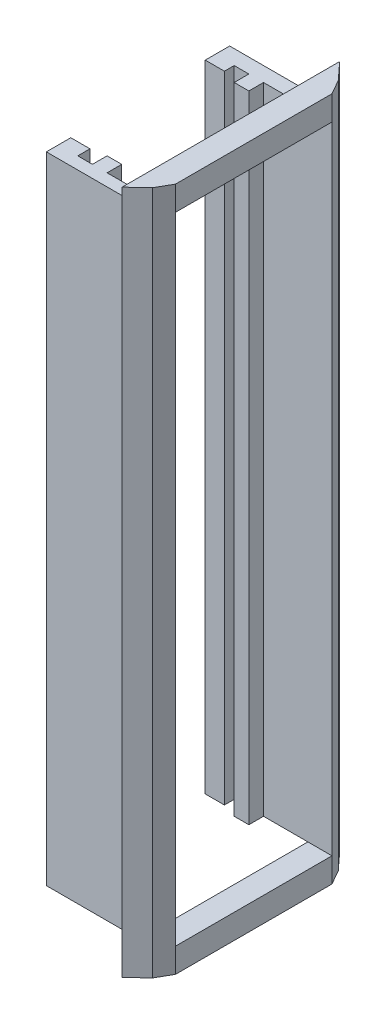
ISO-10303-21;
HEADER;
FILE_DESCRIPTION(('STEP AP214'),'2;1');
FILE_NAME('part.step','',(''),(''),'','','');
FILE_SCHEMA(('AUTOMOTIVE_DESIGN { 1 0 10303 214 1 1 1 1 }'));
ENDSEC;
DATA;
#1=APPLICATION_CONTEXT('core data for automotive mechanical design processes');
#2=APPLICATION_PROTOCOL_DEFINITION('international standard','automotive_design',2000,#1);
#3=PRODUCT_CONTEXT('',#1,'mechanical');
#4=PRODUCT('Part','Part','',(#3));
#5=PRODUCT_RELATED_PRODUCT_CATEGORY('part','',(#4));
#6=PRODUCT_DEFINITION_FORMATION('','',#4);
#7=PRODUCT_DEFINITION_CONTEXT('part definition',#1,'design');
#8=PRODUCT_DEFINITION('design','',#6,#7);
#9=PRODUCT_DEFINITION_SHAPE('','',#8);
#10=(LENGTH_UNIT() NAMED_UNIT(*) SI_UNIT(.MILLI.,.METRE.));
#11=(NAMED_UNIT(*) PLANE_ANGLE_UNIT() SI_UNIT($,.RADIAN.));
#12=(NAMED_UNIT(*) SI_UNIT($,.STERADIAN.) SOLID_ANGLE_UNIT());
#13=UNCERTAINTY_MEASURE_WITH_UNIT(LENGTH_MEASURE(1.E-05),#10,'distance_accuracy_value','');
#14=(GEOMETRIC_REPRESENTATION_CONTEXT(3) GLOBAL_UNCERTAINTY_ASSIGNED_CONTEXT((#13)) GLOBAL_UNIT_ASSIGNED_CONTEXT((#10,
#11,#12)) REPRESENTATION_CONTEXT('',''));
#15=CARTESIAN_POINT('',(0.,0.,0.));
#16=DIRECTION('',(0.,0.,1.));
#17=DIRECTION('',(1.,0.,0.));
#18=AXIS2_PLACEMENT_3D('',#15,#16,#17);
#19=CARTESIAN_POINT('',(0.,0.,0.));
#20=DIRECTION('',(0.,1.,0.));
#21=DIRECTION('',(0.,0.,1.));
#22=AXIS2_PLACEMENT_3D('',#19,#20,#21);
#23=PLANE('',#22);
#24=DIRECTION('',(0.,0.,-1.));
#25=VECTOR('',#24,1.);
#26=CARTESIAN_POINT('',(0.,0.,3.));
#27=LINE('',#26,#25);
#28=CARTESIAN_POINT('',(0.,0.,-27.));
#29=VERTEX_POINT('',#28);
#30=CARTESIAN_POINT('',(0.,0.,-29.));
#31=VERTEX_POINT('',#30);
#32=EDGE_CURVE('E260',#29,#31,#27,.T.);
#33=ORIENTED_EDGE('',*,*,#32,.F.);
#34=DIRECTION('',(-1.,0.,0.));
#35=VECTOR('',#34,1.);
#36=CARTESIAN_POINT('',(2.07535505665509,0.,-27.));
#37=LINE('',#36,#35);
#38=CARTESIAN_POINT('',(-3.92464494334491,0.,-27.));
#39=VERTEX_POINT('',#38);
#40=EDGE_CURVE('E225',#29,#39,#37,.T.);
#41=ORIENTED_EDGE('',*,*,#40,.T.);
#42=DIRECTION('',(0.,0.,1.));
#43=VECTOR('',#42,1.);
#44=CARTESIAN_POINT('',(-3.92464494334491,0.,5.5));
#45=LINE('',#44,#43);
#46=CARTESIAN_POINT('',(-3.92464494334491,0.,-32.));
#47=VERTEX_POINT('',#46);
#48=EDGE_CURVE('E240',#47,#39,#45,.T.);
#49=ORIENTED_EDGE('',*,*,#48,.F.);
#50=DIRECTION('',(-1.,0.,0.));
#51=VECTOR('',#50,1.);
#52=CARTESIAN_POINT('',(-3.92464494334491,0.,-32.));
#53=LINE('',#52,#51);
#54=CARTESIAN_POINT('',(15.0753550566551,0.,-32.));
#55=VERTEX_POINT('',#54);
#56=EDGE_CURVE('E241',#55,#47,#53,.T.);
#57=ORIENTED_EDGE('',*,*,#56,.F.);
#58=DIRECTION('',(0.,0.,-1.));
#59=VECTOR('',#58,1.);
#60=CARTESIAN_POINT('',(15.0753550566551,0.,9.));
#61=LINE('',#60,#59);
#62=CARTESIAN_POINT('',(15.0753550566551,0.,-29.));
#63=VERTEX_POINT('',#62);
#64=EDGE_CURVE('E383',#63,#55,#61,.T.);
#65=ORIENTED_EDGE('',*,*,#64,.F.);
#66=DIRECTION('',(1.,0.,0.));
#67=VECTOR('',#66,1.);
#68=CARTESIAN_POINT('',(6.,0.,-29.));
#69=LINE('',#68,#67);
#70=CARTESIAN_POINT('',(6.,0.,-29.));
#71=VERTEX_POINT('',#70);
#72=EDGE_CURVE('E244',#71,#63,#69,.T.);
#73=ORIENTED_EDGE('',*,*,#72,.F.);
#74=DIRECTION('',(0.,0.,-1.));
#75=VECTOR('',#74,1.);
#76=CARTESIAN_POINT('',(6.,0.,-26.));
#77=LINE('',#76,#75);
#78=CARTESIAN_POINT('',(6.,0.,-26.));
#79=VERTEX_POINT('',#78);
#80=EDGE_CURVE('E368',#79,#71,#77,.T.);
#81=ORIENTED_EDGE('',*,*,#80,.F.);
#82=DIRECTION('',(1.,0.,0.));
#83=VECTOR('',#82,1.);
#84=CARTESIAN_POINT('',(3.,0.,-26.));
#85=LINE('',#84,#83);
#86=CARTESIAN_POINT('',(3.,0.,-26.));
#87=VERTEX_POINT('',#86);
#88=EDGE_CURVE('E367',#87,#79,#85,.T.);
#89=ORIENTED_EDGE('',*,*,#88,.F.);
#90=DIRECTION('',(0.,0.,1.));
#91=VECTOR('',#90,1.);
#92=CARTESIAN_POINT('',(3.,0.,-29.));
#93=LINE('',#92,#91);
#94=CARTESIAN_POINT('',(3.,0.,-29.));
#95=VERTEX_POINT('',#94);
#96=EDGE_CURVE('E364',#95,#87,#93,.T.);
#97=ORIENTED_EDGE('',*,*,#96,.F.);
#98=DIRECTION('',(1.,0.,0.));
#99=VECTOR('',#98,1.);
#100=CARTESIAN_POINT('',(0.,0.,-29.));
#101=LINE('',#100,#99);
#102=EDGE_CURVE('E263',#31,#95,#101,.T.);
#103=ORIENTED_EDGE('',*,*,#102,.F.);
#104=EDGE_LOOP('',(#33,#41,#49,#57,#65,#73,#81,#89,#97,#103));
#105=FACE_BOUND('',#104,.T.);
#106=ADVANCED_FACE('F35',(#105),#23,.F.);
#107=CARTESIAN_POINT('',(-3.92464494334491,130.,5.5));
#108=DIRECTION('',(1.,0.,0.));
#109=DIRECTION('',(0.,0.,-1.));
#110=AXIS2_PLACEMENT_3D('',#107,#108,#109);
#111=PLANE('',#110);
#112=ORIENTED_EDGE('',*,*,#48,.T.);
#113=DIRECTION('',(0.,-1.,0.));
#114=VECTOR('',#113,1.);
#115=CARTESIAN_POINT('',(-3.92464494334491,0.,-27.));
#116=LINE('',#115,#114);
#117=CARTESIAN_POINT('',(-3.92464494334491,130.,-27.));
#118=VERTEX_POINT('',#117);
#119=EDGE_CURVE('E226',#118,#39,#116,.T.);
#120=ORIENTED_EDGE('',*,*,#119,.F.);
#121=DIRECTION('',(0.,0.,1.));
#122=VECTOR('',#121,1.);
#123=CARTESIAN_POINT('',(-3.92464494334491,130.,5.5));
#124=LINE('',#123,#122);
#125=CARTESIAN_POINT('',(-3.92464494334491,130.,-32.));
#126=VERTEX_POINT('',#125);
#127=EDGE_CURVE('E343',#126,#118,#124,.T.);
#128=ORIENTED_EDGE('',*,*,#127,.F.);
#129=DIRECTION('',(0.,-1.,0.));
#130=VECTOR('',#129,1.);
#131=CARTESIAN_POINT('',(-3.92464494334491,130.,-32.));
#132=LINE('',#131,#130);
#133=EDGE_CURVE('E297',#126,#47,#132,.T.);
#134=ORIENTED_EDGE('',*,*,#133,.T.);
#135=EDGE_LOOP('',(#112,#120,#128,#134));
#136=FACE_BOUND('',#135,.T.);
#137=ADVANCED_FACE('F478',(#136),#111,.F.);
#138=CARTESIAN_POINT('',(0.,130.,3.));
#139=DIRECTION('',(-1.,0.,0.));
#140=DIRECTION('',(0.,0.,1.));
#141=AXIS2_PLACEMENT_3D('',#138,#139,#140);
#142=PLANE('',#141);
#143=DIRECTION('',(0.,0.,-1.));
#144=VECTOR('',#143,1.);
#145=CARTESIAN_POINT('',(0.,130.,3.));
#146=LINE('',#145,#144);
#147=CARTESIAN_POINT('',(0.,130.,-27.));
#148=VERTEX_POINT('',#147);
#149=CARTESIAN_POINT('',(0.,130.,-29.));
#150=VERTEX_POINT('',#149);
#151=EDGE_CURVE('E359',#148,#150,#146,.T.);
#152=ORIENTED_EDGE('',*,*,#151,.F.);
#153=DIRECTION('',(0.,-1.,0.));
#154=VECTOR('',#153,1.);
#155=CARTESIAN_POINT('',(0.,130.,-27.));
#156=LINE('',#155,#154);
#157=EDGE_CURVE('E49',#148,#29,#156,.T.);
#158=ORIENTED_EDGE('',*,*,#157,.T.);
#159=ORIENTED_EDGE('',*,*,#32,.T.);
#160=DIRECTION('',(0.,-1.,0.));
#161=VECTOR('',#160,1.);
#162=CARTESIAN_POINT('',(0.,130.,-29.));
#163=LINE('',#162,#161);
#164=EDGE_CURVE('E269',#150,#31,#163,.T.);
#165=ORIENTED_EDGE('',*,*,#164,.F.);
#166=EDGE_LOOP('',(#152,#158,#159,#165));
#167=FACE_BOUND('',#166,.T.);
#168=ADVANCED_FACE('F484',(#167),#142,.F.);
#169=CARTESIAN_POINT('',(0.,130.,0.));
#170=DIRECTION('',(0.,1.,0.));
#171=DIRECTION('',(0.,0.,1.));
#172=AXIS2_PLACEMENT_3D('',#169,#170,#171);
#173=PLANE('',#172);
#174=DIRECTION('',(-1.,0.,0.));
#175=VECTOR('',#174,1.);
#176=CARTESIAN_POINT('',(0.,130.,-27.));
#177=LINE('',#176,#175);
#178=EDGE_CURVE('E11',#148,#118,#177,.T.);
#179=ORIENTED_EDGE('',*,*,#178,.F.);
#180=ORIENTED_EDGE('',*,*,#151,.T.);
#181=DIRECTION('',(1.,0.,0.));
#182=VECTOR('',#181,1.);
#183=CARTESIAN_POINT('',(0.,130.,-29.));
#184=LINE('',#183,#182);
#185=CARTESIAN_POINT('',(3.,130.,-29.));
#186=VERTEX_POINT('',#185);
#187=EDGE_CURVE('E270',#150,#186,#184,.T.);
#188=ORIENTED_EDGE('',*,*,#187,.T.);
#189=DIRECTION('',(0.,0.,1.));
#190=VECTOR('',#189,1.);
#191=CARTESIAN_POINT('',(3.,130.,-29.));
#192=LINE('',#191,#190);
#193=CARTESIAN_POINT('',(3.,130.,-26.));
#194=VERTEX_POINT('',#193);
#195=EDGE_CURVE('E265',#186,#194,#192,.T.);
#196=ORIENTED_EDGE('',*,*,#195,.T.);
#197=DIRECTION('',(1.,0.,0.));
#198=VECTOR('',#197,1.);
#199=CARTESIAN_POINT('',(3.,130.,-26.));
#200=LINE('',#199,#198);
#201=CARTESIAN_POINT('',(6.,130.,-26.));
#202=VERTEX_POINT('',#201);
#203=EDGE_CURVE('E335',#194,#202,#200,.T.);
#204=ORIENTED_EDGE('',*,*,#203,.T.);
#205=DIRECTION('',(0.,0.,-1.));
#206=VECTOR('',#205,1.);
#207=CARTESIAN_POINT('',(6.,130.,-26.));
#208=LINE('',#207,#206);
#209=CARTESIAN_POINT('',(6.,130.,-29.));
#210=VERTEX_POINT('',#209);
#211=EDGE_CURVE('E337',#202,#210,#208,.T.);
#212=ORIENTED_EDGE('',*,*,#211,.T.);
#213=DIRECTION('',(1.,0.,0.));
#214=VECTOR('',#213,1.);
#215=CARTESIAN_POINT('',(6.,130.,-29.));
#216=LINE('',#215,#214);
#217=CARTESIAN_POINT('',(15.0753550566551,130.,-29.));
#218=VERTEX_POINT('',#217);
#219=EDGE_CURVE('E340',#210,#218,#216,.T.);
#220=ORIENTED_EDGE('',*,*,#219,.T.);
#221=DIRECTION('',(0.,0.,1.));
#222=VECTOR('',#221,1.);
#223=CARTESIAN_POINT('',(15.0753550566551,130.,-35.5));
#224=LINE('',#223,#222);
#225=CARTESIAN_POINT('',(15.0753550566551,130.,-32.));
#226=VERTEX_POINT('',#225);
#227=EDGE_CURVE('E390',#226,#218,#224,.T.);
#228=ORIENTED_EDGE('',*,*,#227,.F.);
#229=DIRECTION('',(-1.,0.,0.));
#230=VECTOR('',#229,1.);
#231=CARTESIAN_POINT('',(-3.92464494334491,130.,-32.));
#232=LINE('',#231,#230);
#233=EDGE_CURVE('E342',#226,#126,#232,.T.);
#234=ORIENTED_EDGE('',*,*,#233,.T.);
#235=ORIENTED_EDGE('',*,*,#127,.T.);
#236=EDGE_LOOP('',(#179,#180,#188,#196,#204,#212,#220,#228,#234,#235));
#237=FACE_BOUND('',#236,.T.);
#238=ADVANCED_FACE('F490',(#237),#173,.T.);
#239=CARTESIAN_POINT('',(-3.92464494334491,0.,0.5));
#240=VERTEX_POINT('',#239);
#241=CARTESIAN_POINT('',(-3.92464494334491,0.,5.5));
#242=VERTEX_POINT('',#241);
#243=EDGE_CURVE('E232',#240,#242,#45,.T.);
#244=ORIENTED_EDGE('',*,*,#243,.F.);
#245=DIRECTION('',(-1.,0.,0.));
#246=VECTOR('',#245,1.);
#247=CARTESIAN_POINT('',(2.07535505665509,0.,0.5));
#248=LINE('',#247,#246);
#249=CARTESIAN_POINT('',(0.,0.,0.5));
#250=VERTEX_POINT('',#249);
#251=EDGE_CURVE('E217',#250,#240,#248,.T.);
#252=ORIENTED_EDGE('',*,*,#251,.F.);
#253=CARTESIAN_POINT('',(0.,0.,3.));
#254=VERTEX_POINT('',#253);
#255=EDGE_CURVE('E261',#254,#250,#27,.T.);
#256=ORIENTED_EDGE('',*,*,#255,.F.);
#257=DIRECTION('',(-1.,0.,0.));
#258=VECTOR('',#257,1.);
#259=CARTESIAN_POINT('',(0.,0.,3.));
#260=LINE('',#259,#258);
#261=CARTESIAN_POINT('',(3.,0.,3.));
#262=VERTEX_POINT('',#261);
#263=EDGE_CURVE('E258',#262,#254,#260,.T.);
#264=ORIENTED_EDGE('',*,*,#263,.F.);
#265=DIRECTION('',(0.,0.,1.));
#266=VECTOR('',#265,1.);
#267=CARTESIAN_POINT('',(3.,0.,3.));
#268=LINE('',#267,#266);
#269=CARTESIAN_POINT('',(3.,0.,0.));
#270=VERTEX_POINT('',#269);
#271=EDGE_CURVE('E256',#270,#262,#268,.T.);
#272=ORIENTED_EDGE('',*,*,#271,.F.);
#273=DIRECTION('',(-1.,0.,0.));
#274=VECTOR('',#273,1.);
#275=CARTESIAN_POINT('',(3.,0.,0.));
#276=LINE('',#275,#274);
#277=CARTESIAN_POINT('',(6.,0.,0.));
#278=VERTEX_POINT('',#277);
#279=EDGE_CURVE('E254',#278,#270,#276,.T.);
#280=ORIENTED_EDGE('',*,*,#279,.F.);
#281=DIRECTION('',(0.,0.,-1.));
#282=VECTOR('',#281,1.);
#283=CARTESIAN_POINT('',(6.,0.,0.));
#284=LINE('',#283,#282);
#285=CARTESIAN_POINT('',(6.,0.,3.));
#286=VERTEX_POINT('',#285);
#287=EDGE_CURVE('E251',#286,#278,#284,.T.);
#288=ORIENTED_EDGE('',*,*,#287,.F.);
#289=DIRECTION('',(-1.,0.,0.));
#290=VECTOR('',#289,1.);
#291=CARTESIAN_POINT('',(6.,0.,3.));
#292=LINE('',#291,#290);
#293=CARTESIAN_POINT('',(15.0753550566551,0.,3.));
#294=VERTEX_POINT('',#293);
#295=EDGE_CURVE('E252',#294,#286,#292,.T.);
#296=ORIENTED_EDGE('',*,*,#295,.F.);
#297=CARTESIAN_POINT('',(15.0753550566551,0.,5.5));
#298=VERTEX_POINT('',#297);
#299=EDGE_CURVE('E389',#298,#294,#61,.T.);
#300=ORIENTED_EDGE('',*,*,#299,.F.);
#301=DIRECTION('',(1.,0.,0.));
#302=VECTOR('',#301,1.);
#303=CARTESIAN_POINT('',(-3.92464494334491,0.,5.5));
#304=LINE('',#303,#302);
#305=EDGE_CURVE('E239',#242,#298,#304,.T.);
#306=ORIENTED_EDGE('',*,*,#305,.F.);
#307=EDGE_LOOP('',(#244,#252,#256,#264,#272,#280,#288,#296,#300,#306));
#308=FACE_BOUND('',#307,.T.);
#309=ADVANCED_FACE('F237',(#308),#23,.F.);
#310=CARTESIAN_POINT('',(3.,130.,-29.));
#311=DIRECTION('',(1.,0.,0.));
#312=DIRECTION('',(0.,0.,-1.));
#313=AXIS2_PLACEMENT_3D('',#310,#311,#312);
#314=PLANE('',#313);
#315=ORIENTED_EDGE('',*,*,#96,.T.);
#316=DIRECTION('',(0.,-1.,0.));
#317=VECTOR('',#316,1.);
#318=CARTESIAN_POINT('',(3.,130.,-26.));
#319=LINE('',#318,#317);
#320=EDGE_CURVE('E314',#194,#87,#319,.T.);
#321=ORIENTED_EDGE('',*,*,#320,.F.);
#322=ORIENTED_EDGE('',*,*,#195,.F.);
#323=DIRECTION('',(0.,-1.,0.));
#324=VECTOR('',#323,1.);
#325=CARTESIAN_POINT('',(3.,130.,-29.));
#326=LINE('',#325,#324);
#327=EDGE_CURVE('E266',#186,#95,#326,.T.);
#328=ORIENTED_EDGE('',*,*,#327,.T.);
#329=EDGE_LOOP('',(#315,#321,#322,#328));
#330=FACE_BOUND('',#329,.T.);
#331=ADVANCED_FACE('F37',(#330),#314,.F.);
#332=CARTESIAN_POINT('',(3.,130.,-26.));
#333=DIRECTION('',(0.,0.,-1.));
#334=DIRECTION('',(-1.,0.,0.));
#335=AXIS2_PLACEMENT_3D('',#332,#333,#334);
#336=PLANE('',#335);
#337=ORIENTED_EDGE('',*,*,#88,.T.);
#338=DIRECTION('',(0.,-1.,0.));
#339=VECTOR('',#338,1.);
#340=CARTESIAN_POINT('',(6.,130.,-26.));
#341=LINE('',#340,#339);
#342=EDGE_CURVE('E311',#202,#79,#341,.T.);
#343=ORIENTED_EDGE('',*,*,#342,.F.);
#344=ORIENTED_EDGE('',*,*,#203,.F.);
#345=ORIENTED_EDGE('',*,*,#320,.T.);
#346=EDGE_LOOP('',(#337,#343,#344,#345));
#347=FACE_BOUND('',#346,.T.);
#348=ADVANCED_FACE('F496',(#347),#336,.F.);
#349=CARTESIAN_POINT('',(6.,130.,-26.));
#350=DIRECTION('',(-1.,0.,0.));
#351=DIRECTION('',(0.,0.,1.));
#352=AXIS2_PLACEMENT_3D('',#349,#350,#351);
#353=PLANE('',#352);
#354=ORIENTED_EDGE('',*,*,#80,.T.);
#355=DIRECTION('',(0.,-1.,0.));
#356=VECTOR('',#355,1.);
#357=CARTESIAN_POINT('',(6.,130.,-29.));
#358=LINE('',#357,#356);
#359=EDGE_CURVE('E308',#210,#71,#358,.T.);
#360=ORIENTED_EDGE('',*,*,#359,.F.);
#361=ORIENTED_EDGE('',*,*,#211,.F.);
#362=ORIENTED_EDGE('',*,*,#342,.T.);
#363=EDGE_LOOP('',(#354,#360,#361,#362));
#364=FACE_BOUND('',#363,.T.);
#365=ADVANCED_FACE('F587',(#364),#353,.F.);
#366=CARTESIAN_POINT('',(6.,130.,-29.));
#367=DIRECTION('',(0.,0.,-1.));
#368=DIRECTION('',(-1.,0.,0.));
#369=AXIS2_PLACEMENT_3D('',#366,#367,#368);
#370=PLANE('',#369);
#371=ORIENTED_EDGE('',*,*,#72,.T.);
#372=CARTESIAN_POINT('',(20.,0.,-29.));
#373=VERTEX_POINT('',#372);
#374=EDGE_CURVE('E369',#63,#373,#69,.T.);
#375=ORIENTED_EDGE('',*,*,#374,.T.);
#376=DIRECTION('',(0.,-1.,0.));
#377=VECTOR('',#376,1.);
#378=CARTESIAN_POINT('',(20.,130.,-29.));
#379=LINE('',#378,#377);
#380=CARTESIAN_POINT('',(20.,130.,-29.));
#381=VERTEX_POINT('',#380);
#382=EDGE_CURVE('E305',#381,#373,#379,.T.);
#383=ORIENTED_EDGE('',*,*,#382,.F.);
#384=EDGE_CURVE('E339',#218,#381,#216,.T.);
#385=ORIENTED_EDGE('',*,*,#384,.F.);
#386=ORIENTED_EDGE('',*,*,#219,.F.);
#387=ORIENTED_EDGE('',*,*,#359,.T.);
#388=EDGE_LOOP('',(#371,#375,#383,#385,#386,#387));
#389=FACE_BOUND('',#388,.T.);
#390=ADVANCED_FACE('F377',(#389),#370,.F.);
#391=CARTESIAN_POINT('',(18.2906223594552,130.,-32.));
#392=DIRECTION('',(-0.868854805469174,0.,0.495066992449631));
#393=DIRECTION('',(0.495066992449631,0.,0.868854805469174));
#394=AXIS2_PLACEMENT_3D('',#391,#392,#393);
#395=PLANE('',#394);
#396=ORIENTED_EDGE('',*,*,#382,.T.);
#397=DIRECTION('',(0.,1.,0.));
#398=VECTOR('',#397,1.);
#399=CARTESIAN_POINT('',(20.,-5.,-29.));
#400=LINE('',#399,#398);
#401=CARTESIAN_POINT('',(20.,-5.,-29.));
#402=VERTEX_POINT('',#401);
#403=EDGE_CURVE('E330',#402,#373,#400,.T.);
#404=ORIENTED_EDGE('',*,*,#403,.F.);
#405=DIRECTION('',(0.495066992449631,0.,0.868854805469174));
#406=VECTOR('',#405,1.);
#407=CARTESIAN_POINT('',(18.2906223594552,-5.,-32.));
#408=LINE('',#407,#406);
#409=CARTESIAN_POINT('',(18.2906223594552,-5.,-32.));
#410=VERTEX_POINT('',#409);
#411=EDGE_CURVE('E655',#410,#402,#408,.T.);
#412=ORIENTED_EDGE('',*,*,#411,.F.);
#413=DIRECTION('',(0.,-1.,0.));
#414=VECTOR('',#413,1.);
#415=CARTESIAN_POINT('',(18.2906223594552,130.,-32.));
#416=LINE('',#415,#414);
#417=CARTESIAN_POINT('',(18.2906223594552,135.,-32.));
#418=VERTEX_POINT('',#417);
#419=EDGE_CURVE('E303',#418,#410,#416,.T.);
#420=ORIENTED_EDGE('',*,*,#419,.F.);
#421=DIRECTION('',(-0.495066992449631,0.,-0.868854805469174));
#422=VECTOR('',#421,1.);
#423=CARTESIAN_POINT('',(20.,135.,-29.));
#424=LINE('',#423,#422);
#425=CARTESIAN_POINT('',(20.,135.,-29.));
#426=VERTEX_POINT('',#425);
#427=EDGE_CURVE('E674',#426,#418,#424,.T.);
#428=ORIENTED_EDGE('',*,*,#427,.F.);
#429=DIRECTION('',(0.,-1.,0.));
#430=VECTOR('',#429,1.);
#431=CARTESIAN_POINT('',(20.,135.,-29.));
#432=LINE('',#431,#430);
#433=EDGE_CURVE('E677',#426,#381,#432,.T.);
#434=ORIENTED_EDGE('',*,*,#433,.T.);
#435=EDGE_LOOP('',(#396,#404,#412,#420,#428,#434));
#436=FACE_BOUND('',#435,.T.);
#437=ADVANCED_FACE('F613',(#436),#395,.F.);
#438=CARTESIAN_POINT('',(15.0753550566551,130.,-35.5));
#439=DIRECTION('',(-0.736426986320433,0.,0.676517031433063));
#440=DIRECTION('',(0.676517031433063,0.,0.736426986320433));
#441=AXIS2_PLACEMENT_3D('',#438,#439,#440);
#442=PLANE('',#441);
#443=ORIENTED_EDGE('',*,*,#419,.T.);
#444=DIRECTION('',(0.676517031433063,0.,0.736426986320433));
#445=VECTOR('',#444,1.);
#446=CARTESIAN_POINT('',(15.0753550566551,-5.,-35.5));
#447=LINE('',#446,#445);
#448=CARTESIAN_POINT('',(15.0753550566551,-5.,-35.5));
#449=VERTEX_POINT('',#448);
#450=EDGE_CURVE('E644',#449,#410,#447,.T.);
#451=ORIENTED_EDGE('',*,*,#450,.F.);
#452=DIRECTION('',(0.,-1.,0.));
#453=VECTOR('',#452,1.);
#454=CARTESIAN_POINT('',(15.0753550566551,130.,-35.5));
#455=LINE('',#454,#453);
#456=CARTESIAN_POINT('',(15.0753550566551,135.,-35.5));
#457=VERTEX_POINT('',#456);
#458=EDGE_CURVE('E301',#457,#449,#455,.T.);
#459=ORIENTED_EDGE('',*,*,#458,.F.);
#460=DIRECTION('',(-0.676517031433063,0.,-0.736426986320433));
#461=VECTOR('',#460,1.);
#462=CARTESIAN_POINT('',(18.2906223594552,135.,-32.));
#463=LINE('',#462,#461);
#464=EDGE_CURVE('E664',#418,#457,#463,.T.);
#465=ORIENTED_EDGE('',*,*,#464,.F.);
#466=EDGE_LOOP('',(#443,#451,#459,#465));
#467=FACE_BOUND('',#466,.T.);
#468=ADVANCED_FACE('F616',(#467),#442,.F.);
#469=CARTESIAN_POINT('',(-3.92464494334491,130.,-32.));
#470=DIRECTION('',(0.,0.,1.));
#471=DIRECTION('',(1.,0.,0.));
#472=AXIS2_PLACEMENT_3D('',#469,#470,#471);
#473=PLANE('',#472);
#474=ORIENTED_EDGE('',*,*,#56,.T.);
#475=ORIENTED_EDGE('',*,*,#133,.F.);
#476=ORIENTED_EDGE('',*,*,#233,.F.);
#477=DIRECTION('',(0.,-1.,0.));
#478=VECTOR('',#477,1.);
#479=CARTESIAN_POINT('',(15.0753550566551,130.,-32.));
#480=LINE('',#479,#478);
#481=EDGE_CURVE('E300',#226,#55,#480,.T.);
#482=ORIENTED_EDGE('',*,*,#481,.T.);
#483=EDGE_LOOP('',(#474,#475,#476,#482));
#484=FACE_BOUND('',#483,.T.);
#485=ADVANCED_FACE('F547',(#484),#473,.F.);
#486=CARTESIAN_POINT('',(-3.92464494334491,130.,0.5));
#487=VERTEX_POINT('',#486);
#488=CARTESIAN_POINT('',(-3.92464494334491,130.,5.5));
#489=VERTEX_POINT('',#488);
#490=EDGE_CURVE('E234',#487,#489,#124,.T.);
#491=ORIENTED_EDGE('',*,*,#490,.F.);
#492=DIRECTION('',(0.,1.,0.));
#493=VECTOR('',#492,1.);
#494=CARTESIAN_POINT('',(-3.92464494334491,0.,0.5));
#495=LINE('',#494,#493);
#496=EDGE_CURVE('E57',#240,#487,#495,.T.);
#497=ORIENTED_EDGE('',*,*,#496,.F.);
#498=ORIENTED_EDGE('',*,*,#243,.T.);
#499=DIRECTION('',(0.,-1.,0.));
#500=VECTOR('',#499,1.);
#501=CARTESIAN_POINT('',(-3.92464494334491,130.,5.5));
#502=LINE('',#501,#500);
#503=EDGE_CURVE('E295',#489,#242,#502,.T.);
#504=ORIENTED_EDGE('',*,*,#503,.F.);
#505=EDGE_LOOP('',(#491,#497,#498,#504));
#506=FACE_BOUND('',#505,.T.);
#507=ADVANCED_FACE('F230',(#506),#111,.F.);
#508=CARTESIAN_POINT('',(-3.92464494334491,130.,5.5));
#509=DIRECTION('',(0.,0.,-1.));
#510=DIRECTION('',(-1.,0.,0.));
#511=AXIS2_PLACEMENT_3D('',#508,#509,#510);
#512=PLANE('',#511);
#513=ORIENTED_EDGE('',*,*,#305,.T.);
#514=DIRECTION('',(0.,-1.,0.));
#515=VECTOR('',#514,1.);
#516=CARTESIAN_POINT('',(15.0753550566551,130.,5.5));
#517=LINE('',#516,#515);
#518=CARTESIAN_POINT('',(15.0753550566551,130.,5.5));
#519=VERTEX_POINT('',#518);
#520=EDGE_CURVE('E294',#519,#298,#517,.T.);
#521=ORIENTED_EDGE('',*,*,#520,.F.);
#522=DIRECTION('',(1.,0.,0.));
#523=VECTOR('',#522,1.);
#524=CARTESIAN_POINT('',(-3.92464494334491,130.,5.5));
#525=LINE('',#524,#523);
#526=EDGE_CURVE('E346',#489,#519,#525,.T.);
#527=ORIENTED_EDGE('',*,*,#526,.F.);
#528=ORIENTED_EDGE('',*,*,#503,.T.);
#529=EDGE_LOOP('',(#513,#521,#527,#528));
#530=FACE_BOUND('',#529,.T.);
#531=ADVANCED_FACE('F460',(#530),#512,.F.);
#532=CARTESIAN_POINT('',(15.0753550566551,130.,5.5));
#533=DIRECTION('',(1.,0.,0.));
#534=DIRECTION('',(0.,0.,-1.));
#535=AXIS2_PLACEMENT_3D('',#532,#533,#534);
#536=PLANE('',#535);
#537=DIRECTION('',(0.,0.,-1.));
#538=VECTOR('',#537,1.);
#539=CARTESIAN_POINT('',(15.0753550566551,-5.,9.));
#540=LINE('',#539,#538);
#541=CARTESIAN_POINT('',(15.0753550566551,-5.,9.));
#542=VERTEX_POINT('',#541);
#543=EDGE_CURVE('E640',#542,#449,#540,.T.);
#544=ORIENTED_EDGE('',*,*,#543,.F.);
#545=DIRECTION('',(0.,-1.,0.));
#546=VECTOR('',#545,1.);
#547=CARTESIAN_POINT('',(15.0753550566551,130.,9.));
#548=LINE('',#547,#546);
#549=CARTESIAN_POINT('',(15.0753550566551,135.,9.));
#550=VERTEX_POINT('',#549);
#551=EDGE_CURVE('E292',#550,#542,#548,.T.);
#552=ORIENTED_EDGE('',*,*,#551,.F.);
#553=DIRECTION('',(0.,0.,1.));
#554=VECTOR('',#553,1.);
#555=CARTESIAN_POINT('',(15.0753550566551,135.,-35.5));
#556=LINE('',#555,#554);
#557=EDGE_CURVE('E667',#457,#550,#556,.T.);
#558=ORIENTED_EDGE('',*,*,#557,.F.);
#559=ORIENTED_EDGE('',*,*,#458,.T.);
#560=EDGE_LOOP('',(#544,#552,#558,#559));
#561=FACE_BOUND('',#560,.T.);
#562=ORIENTED_EDGE('',*,*,#520,.T.);
#563=ORIENTED_EDGE('',*,*,#299,.T.);
#564=EDGE_CURVE('E435',#294,#63,#61,.T.);
#565=ORIENTED_EDGE('',*,*,#564,.T.);
#566=ORIENTED_EDGE('',*,*,#64,.T.);
#567=ORIENTED_EDGE('',*,*,#481,.F.);
#568=ORIENTED_EDGE('',*,*,#227,.T.);
#569=CARTESIAN_POINT('',(15.0753550566551,130.,3.));
#570=VERTEX_POINT('',#569);
#571=EDGE_CURVE('E325',#218,#570,#224,.T.);
#572=ORIENTED_EDGE('',*,*,#571,.T.);
#573=EDGE_CURVE('E317',#570,#519,#224,.T.);
#574=ORIENTED_EDGE('',*,*,#573,.T.);
#575=EDGE_LOOP('',(#562,#563,#565,#566,#567,#568,#572,#574));
#576=FACE_BOUND('',#575,.T.);
#577=ADVANCED_FACE('F442',(#561,#576),#536,.F.);
#578=CARTESIAN_POINT('',(15.0753550566551,130.,9.));
#579=DIRECTION('',(-0.682206899804954,0.,-0.731159179562504));
#580=DIRECTION('',(-0.731159179562504,0.,0.682206899804954));
#581=AXIS2_PLACEMENT_3D('',#578,#579,#580);
#582=PLANE('',#581);
#583=ORIENTED_EDGE('',*,*,#551,.T.);
#584=DIRECTION('',(-0.731159179562504,0.,0.682206899804954));
#585=VECTOR('',#584,1.);
#586=CARTESIAN_POINT('',(18.2906223594552,-5.,6.));
#587=LINE('',#586,#585);
#588=CARTESIAN_POINT('',(18.2906223594552,-5.,6.));
#589=VERTEX_POINT('',#588);
#590=EDGE_CURVE('E634',#589,#542,#587,.T.);
#591=ORIENTED_EDGE('',*,*,#590,.F.);
#592=DIRECTION('',(0.,-1.,0.));
#593=VECTOR('',#592,1.);
#594=CARTESIAN_POINT('',(18.2906223594552,130.,6.));
#595=LINE('',#594,#593);
#596=CARTESIAN_POINT('',(18.2906223594552,135.,6.));
#597=VERTEX_POINT('',#596);
#598=EDGE_CURVE('E290',#597,#589,#595,.T.);
#599=ORIENTED_EDGE('',*,*,#598,.F.);
#600=DIRECTION('',(0.731159179562504,0.,-0.682206899804954));
#601=VECTOR('',#600,1.);
#602=CARTESIAN_POINT('',(15.0753550566551,135.,9.));
#603=LINE('',#602,#601);
#604=EDGE_CURVE('E636',#550,#597,#603,.T.);
#605=ORIENTED_EDGE('',*,*,#604,.F.);
#606=EDGE_LOOP('',(#583,#591,#599,#605));
#607=FACE_BOUND('',#606,.T.);
#608=ADVANCED_FACE('F474',(#607),#582,.F.);
#609=CARTESIAN_POINT('',(18.2906223594552,130.,6.));
#610=DIRECTION('',(-0.868854805469175,0.,-0.49506699244963));
#611=DIRECTION('',(-0.49506699244963,0.,0.868854805469175));
#612=AXIS2_PLACEMENT_3D('',#609,#610,#611);
#613=PLANE('',#612);
#614=ORIENTED_EDGE('',*,*,#598,.T.);
#615=DIRECTION('',(-0.49506699244963,0.,0.868854805469175));
#616=VECTOR('',#615,1.);
#617=CARTESIAN_POINT('',(20.,-5.,3.));
#618=LINE('',#617,#616);
#619=CARTESIAN_POINT('',(20.,-5.,3.));
#620=VERTEX_POINT('',#619);
#621=EDGE_CURVE('E649',#620,#589,#618,.T.);
#622=ORIENTED_EDGE('',*,*,#621,.F.);
#623=DIRECTION('',(0.,1.,0.));
#624=VECTOR('',#623,1.);
#625=CARTESIAN_POINT('',(20.,-5.,3.));
#626=LINE('',#625,#624);
#627=CARTESIAN_POINT('',(20.,0.,3.));
#628=VERTEX_POINT('',#627);
#629=EDGE_CURVE('E659',#620,#628,#626,.T.);
#630=ORIENTED_EDGE('',*,*,#629,.T.);
#631=DIRECTION('',(0.,-1.,0.));
#632=VECTOR('',#631,1.);
#633=CARTESIAN_POINT('',(20.,130.,3.));
#634=LINE('',#633,#632);
#635=CARTESIAN_POINT('',(20.,130.,3.));
#636=VERTEX_POINT('',#635);
#637=EDGE_CURVE('E288',#636,#628,#634,.T.);
#638=ORIENTED_EDGE('',*,*,#637,.F.);
#639=DIRECTION('',(0.,-1.,0.));
#640=VECTOR('',#639,1.);
#641=CARTESIAN_POINT('',(20.,135.,3.));
#642=LINE('',#641,#640);
#643=CARTESIAN_POINT('',(20.,135.,3.));
#644=VERTEX_POINT('',#643);
#645=EDGE_CURVE('E331',#644,#636,#642,.T.);
#646=ORIENTED_EDGE('',*,*,#645,.F.);
#647=DIRECTION('',(0.49506699244963,0.,-0.868854805469175));
#648=VECTOR('',#647,1.);
#649=CARTESIAN_POINT('',(18.2906223594552,135.,6.));
#650=LINE('',#649,#648);
#651=EDGE_CURVE('E670',#597,#644,#650,.T.);
#652=ORIENTED_EDGE('',*,*,#651,.F.);
#653=EDGE_LOOP('',(#614,#622,#630,#638,#646,#652));
#654=FACE_BOUND('',#653,.T.);
#655=ADVANCED_FACE('F465',(#654),#613,.F.);
#656=CARTESIAN_POINT('',(6.,130.,3.));
#657=DIRECTION('',(0.,0.,1.));
#658=DIRECTION('',(1.,0.,0.));
#659=AXIS2_PLACEMENT_3D('',#656,#657,#658);
#660=PLANE('',#659);
#661=EDGE_CURVE('E249',#628,#294,#292,.T.);
#662=ORIENTED_EDGE('',*,*,#661,.T.);
#663=ORIENTED_EDGE('',*,*,#295,.T.);
#664=DIRECTION('',(0.,-1.,0.));
#665=VECTOR('',#664,1.);
#666=CARTESIAN_POINT('',(6.,130.,3.));
#667=LINE('',#666,#665);
#668=CARTESIAN_POINT('',(6.,130.,3.));
#669=VERTEX_POINT('',#668);
#670=EDGE_CURVE('E285',#669,#286,#667,.T.);
#671=ORIENTED_EDGE('',*,*,#670,.F.);
#672=DIRECTION('',(-1.,0.,0.));
#673=VECTOR('',#672,1.);
#674=CARTESIAN_POINT('',(6.,130.,3.));
#675=LINE('',#674,#673);
#676=EDGE_CURVE('E351',#570,#669,#675,.T.);
#677=ORIENTED_EDGE('',*,*,#676,.F.);
#678=EDGE_CURVE('E347',#636,#570,#675,.T.);
#679=ORIENTED_EDGE('',*,*,#678,.F.);
#680=ORIENTED_EDGE('',*,*,#637,.T.);
#681=EDGE_LOOP('',(#662,#663,#671,#677,#679,#680));
#682=FACE_BOUND('',#681,.T.);
#683=ADVANCED_FACE('F463',(#682),#660,.F.);
#684=CARTESIAN_POINT('',(6.,130.,0.));
#685=DIRECTION('',(-1.,0.,0.));
#686=DIRECTION('',(0.,0.,1.));
#687=AXIS2_PLACEMENT_3D('',#684,#685,#686);
#688=PLANE('',#687);
#689=ORIENTED_EDGE('',*,*,#287,.T.);
#690=DIRECTION('',(0.,-1.,0.));
#691=VECTOR('',#690,1.);
#692=CARTESIAN_POINT('',(6.,130.,0.));
#693=LINE('',#692,#691);
#694=CARTESIAN_POINT('',(6.,130.,0.));
#695=VERTEX_POINT('',#694);
#696=EDGE_CURVE('E282',#695,#278,#693,.T.);
#697=ORIENTED_EDGE('',*,*,#696,.F.);
#698=DIRECTION('',(0.,0.,-1.));
#699=VECTOR('',#698,1.);
#700=CARTESIAN_POINT('',(6.,130.,0.));
#701=LINE('',#700,#699);
#702=EDGE_CURVE('E350',#669,#695,#701,.T.);
#703=ORIENTED_EDGE('',*,*,#702,.F.);
#704=ORIENTED_EDGE('',*,*,#670,.T.);
#705=EDGE_LOOP('',(#689,#697,#703,#704));
#706=FACE_BOUND('',#705,.T.);
#707=ADVANCED_FACE('F428',(#706),#688,.F.);
#708=CARTESIAN_POINT('',(3.,130.,0.));
#709=DIRECTION('',(0.,0.,1.));
#710=DIRECTION('',(1.,0.,0.));
#711=AXIS2_PLACEMENT_3D('',#708,#709,#710);
#712=PLANE('',#711);
#713=ORIENTED_EDGE('',*,*,#279,.T.);
#714=DIRECTION('',(0.,-1.,0.));
#715=VECTOR('',#714,1.);
#716=CARTESIAN_POINT('',(3.,130.,0.));
#717=LINE('',#716,#715);
#718=CARTESIAN_POINT('',(3.,130.,0.));
#719=VERTEX_POINT('',#718);
#720=EDGE_CURVE('E279',#719,#270,#717,.T.);
#721=ORIENTED_EDGE('',*,*,#720,.F.);
#722=DIRECTION('',(-1.,0.,0.));
#723=VECTOR('',#722,1.);
#724=CARTESIAN_POINT('',(3.,130.,0.));
#725=LINE('',#724,#723);
#726=EDGE_CURVE('E353',#695,#719,#725,.T.);
#727=ORIENTED_EDGE('',*,*,#726,.F.);
#728=ORIENTED_EDGE('',*,*,#696,.T.);
#729=EDGE_LOOP('',(#713,#721,#727,#728));
#730=FACE_BOUND('',#729,.T.);
#731=ADVANCED_FACE('F424',(#730),#712,.F.);
#732=CARTESIAN_POINT('',(3.,130.,3.));
#733=DIRECTION('',(1.,0.,0.));
#734=DIRECTION('',(0.,0.,-1.));
#735=AXIS2_PLACEMENT_3D('',#732,#733,#734);
#736=PLANE('',#735);
#737=ORIENTED_EDGE('',*,*,#271,.T.);
#738=DIRECTION('',(0.,-1.,0.));
#739=VECTOR('',#738,1.);
#740=CARTESIAN_POINT('',(3.,130.,3.));
#741=LINE('',#740,#739);
#742=CARTESIAN_POINT('',(3.,130.,3.));
#743=VERTEX_POINT('',#742);
#744=EDGE_CURVE('E276',#743,#262,#741,.T.);
#745=ORIENTED_EDGE('',*,*,#744,.F.);
#746=DIRECTION('',(0.,0.,1.));
#747=VECTOR('',#746,1.);
#748=CARTESIAN_POINT('',(3.,130.,3.));
#749=LINE('',#748,#747);
#750=EDGE_CURVE('E355',#719,#743,#749,.T.);
#751=ORIENTED_EDGE('',*,*,#750,.F.);
#752=ORIENTED_EDGE('',*,*,#720,.T.);
#753=EDGE_LOOP('',(#737,#745,#751,#752));
#754=FACE_BOUND('',#753,.T.);
#755=ADVANCED_FACE('F420',(#754),#736,.F.);
#756=CARTESIAN_POINT('',(0.,130.,3.));
#757=DIRECTION('',(0.,0.,1.));
#758=DIRECTION('',(1.,0.,0.));
#759=AXIS2_PLACEMENT_3D('',#756,#757,#758);
#760=PLANE('',#759);
#761=ORIENTED_EDGE('',*,*,#263,.T.);
#762=DIRECTION('',(0.,-1.,0.));
#763=VECTOR('',#762,1.);
#764=CARTESIAN_POINT('',(0.,130.,3.));
#765=LINE('',#764,#763);
#766=CARTESIAN_POINT('',(0.,130.,3.));
#767=VERTEX_POINT('',#766);
#768=EDGE_CURVE('E273',#767,#254,#765,.T.);
#769=ORIENTED_EDGE('',*,*,#768,.F.);
#770=DIRECTION('',(-1.,0.,0.));
#771=VECTOR('',#770,1.);
#772=CARTESIAN_POINT('',(0.,130.,3.));
#773=LINE('',#772,#771);
#774=EDGE_CURVE('E357',#743,#767,#773,.T.);
#775=ORIENTED_EDGE('',*,*,#774,.F.);
#776=ORIENTED_EDGE('',*,*,#744,.T.);
#777=EDGE_LOOP('',(#761,#769,#775,#776));
#778=FACE_BOUND('',#777,.T.);
#779=ADVANCED_FACE('F414',(#778),#760,.F.);
#780=ORIENTED_EDGE('',*,*,#255,.T.);
#781=DIRECTION('',(0.,1.,0.));
#782=VECTOR('',#781,1.);
#783=CARTESIAN_POINT('',(0.,130.,0.5));
#784=LINE('',#783,#782);
#785=CARTESIAN_POINT('',(0.,130.,0.5));
#786=VERTEX_POINT('',#785);
#787=EDGE_CURVE('E220',#250,#786,#784,.T.);
#788=ORIENTED_EDGE('',*,*,#787,.T.);
#789=EDGE_CURVE('E360',#767,#786,#146,.T.);
#790=ORIENTED_EDGE('',*,*,#789,.F.);
#791=ORIENTED_EDGE('',*,*,#768,.T.);
#792=EDGE_LOOP('',(#780,#788,#790,#791));
#793=FACE_BOUND('',#792,.T.);
#794=ADVANCED_FACE('F406',(#793),#142,.F.);
#795=CARTESIAN_POINT('',(0.,130.,-29.));
#796=DIRECTION('',(0.,0.,-1.));
#797=DIRECTION('',(-1.,0.,0.));
#798=AXIS2_PLACEMENT_3D('',#795,#796,#797);
#799=PLANE('',#798);
#800=ORIENTED_EDGE('',*,*,#102,.T.);
#801=ORIENTED_EDGE('',*,*,#327,.F.);
#802=ORIENTED_EDGE('',*,*,#187,.F.);
#803=ORIENTED_EDGE('',*,*,#164,.T.);
#804=EDGE_LOOP('',(#800,#801,#802,#803));
#805=FACE_BOUND('',#804,.T.);
#806=ADVANCED_FACE('F506',(#805),#799,.F.);
#807=DIRECTION('',(1.,0.,0.));
#808=VECTOR('',#807,1.);
#809=CARTESIAN_POINT('',(0.,130.,0.5));
#810=LINE('',#809,#808);
#811=EDGE_CURVE('E43',#487,#786,#810,.T.);
#812=ORIENTED_EDGE('',*,*,#811,.F.);
#813=ORIENTED_EDGE('',*,*,#490,.T.);
#814=ORIENTED_EDGE('',*,*,#526,.T.);
#815=ORIENTED_EDGE('',*,*,#573,.F.);
#816=ORIENTED_EDGE('',*,*,#676,.T.);
#817=ORIENTED_EDGE('',*,*,#702,.T.);
#818=ORIENTED_EDGE('',*,*,#726,.T.);
#819=ORIENTED_EDGE('',*,*,#750,.T.);
#820=ORIENTED_EDGE('',*,*,#774,.T.);
#821=ORIENTED_EDGE('',*,*,#789,.T.);
#822=EDGE_LOOP('',(#812,#813,#814,#815,#816,#817,#818,#819,#820,#821));
#823=FACE_BOUND('',#822,.T.);
#824=ADVANCED_FACE('F408',(#823),#173,.T.);
#825=CARTESIAN_POINT('',(20.,135.,3.));
#826=DIRECTION('',(-1.,0.,0.));
#827=DIRECTION('',(0.,0.,1.));
#828=AXIS2_PLACEMENT_3D('',#825,#826,#827);
#829=PLANE('',#828);
#830=DIRECTION('',(0.,0.,-1.));
#831=VECTOR('',#830,1.);
#832=CARTESIAN_POINT('',(20.,130.,3.));
#833=LINE('',#832,#831);
#834=EDGE_CURVE('E329',#636,#381,#833,.T.);
#835=ORIENTED_EDGE('',*,*,#834,.T.);
#836=ORIENTED_EDGE('',*,*,#433,.F.);
#837=DIRECTION('',(0.,0.,-1.));
#838=VECTOR('',#837,1.);
#839=CARTESIAN_POINT('',(20.,135.,3.));
#840=LINE('',#839,#838);
#841=EDGE_CURVE('E672',#644,#426,#840,.T.);
#842=ORIENTED_EDGE('',*,*,#841,.F.);
#843=ORIENTED_EDGE('',*,*,#645,.T.);
#844=EDGE_LOOP('',(#835,#836,#842,#843));
#845=FACE_BOUND('',#844,.T.);
#846=ADVANCED_FACE('F505',(#845),#829,.F.);
#847=CARTESIAN_POINT('',(0.,135.,0.));
#848=DIRECTION('',(0.,-1.,0.));
#849=DIRECTION('',(0.,0.,-1.));
#850=AXIS2_PLACEMENT_3D('',#847,#848,#849);
#851=PLANE('',#850);
#852=ORIENTED_EDGE('',*,*,#464,.T.);
#853=ORIENTED_EDGE('',*,*,#557,.T.);
#854=ORIENTED_EDGE('',*,*,#604,.T.);
#855=ORIENTED_EDGE('',*,*,#651,.T.);
#856=ORIENTED_EDGE('',*,*,#841,.T.);
#857=ORIENTED_EDGE('',*,*,#427,.T.);
#858=EDGE_LOOP('',(#852,#853,#854,#855,#856,#857));
#859=FACE_BOUND('',#858,.T.);
#860=ADVANCED_FACE('F512',(#859),#851,.F.);
#861=CARTESIAN_POINT('',(0.,130.,0.));
#862=DIRECTION('',(0.,-1.,0.));
#863=DIRECTION('',(0.,0.,-1.));
#864=AXIS2_PLACEMENT_3D('',#861,#862,#863);
#865=PLANE('',#864);
#866=ORIENTED_EDGE('',*,*,#571,.F.);
#867=ORIENTED_EDGE('',*,*,#384,.T.);
#868=ORIENTED_EDGE('',*,*,#834,.F.);
#869=ORIENTED_EDGE('',*,*,#678,.T.);
#870=EDGE_LOOP('',(#866,#867,#868,#869));
#871=FACE_BOUND('',#870,.T.);
#872=ADVANCED_FACE('F690',(#871),#865,.T.);
#873=CARTESIAN_POINT('',(0.,0.,0.));
#874=DIRECTION('',(0.,1.,0.));
#875=DIRECTION('',(0.,0.,1.));
#876=AXIS2_PLACEMENT_3D('',#873,#874,#875);
#877=PLANE('',#876);
#878=ORIENTED_EDGE('',*,*,#661,.F.);
#879=DIRECTION('',(0.,0.,1.));
#880=VECTOR('',#879,1.);
#881=CARTESIAN_POINT('',(20.,0.,-29.));
#882=LINE('',#881,#880);
#883=EDGE_CURVE('E439',#373,#628,#882,.T.);
#884=ORIENTED_EDGE('',*,*,#883,.F.);
#885=ORIENTED_EDGE('',*,*,#374,.F.);
#886=ORIENTED_EDGE('',*,*,#564,.F.);
#887=EDGE_LOOP('',(#878,#884,#885,#886));
#888=FACE_BOUND('',#887,.T.);
#889=ADVANCED_FACE('F436',(#888),#877,.T.);
#890=CARTESIAN_POINT('',(20.,-5.,-29.));
#891=DIRECTION('',(-1.,0.,0.));
#892=DIRECTION('',(0.,0.,1.));
#893=AXIS2_PLACEMENT_3D('',#890,#891,#892);
#894=PLANE('',#893);
#895=ORIENTED_EDGE('',*,*,#883,.T.);
#896=ORIENTED_EDGE('',*,*,#629,.F.);
#897=DIRECTION('',(0.,0.,1.));
#898=VECTOR('',#897,1.);
#899=CARTESIAN_POINT('',(20.,-5.,-29.));
#900=LINE('',#899,#898);
#901=EDGE_CURVE('E657',#402,#620,#900,.T.);
#902=ORIENTED_EDGE('',*,*,#901,.F.);
#903=ORIENTED_EDGE('',*,*,#403,.T.);
#904=EDGE_LOOP('',(#895,#896,#902,#903));
#905=FACE_BOUND('',#904,.T.);
#906=ADVANCED_FACE('F697',(#905),#894,.F.);
#907=CARTESIAN_POINT('',(0.,-5.,0.));
#908=DIRECTION('',(0.,1.,0.));
#909=DIRECTION('',(0.,0.,1.));
#910=AXIS2_PLACEMENT_3D('',#907,#908,#909);
#911=PLANE('',#910);
#912=ORIENTED_EDGE('',*,*,#590,.T.);
#913=ORIENTED_EDGE('',*,*,#543,.T.);
#914=ORIENTED_EDGE('',*,*,#450,.T.);
#915=ORIENTED_EDGE('',*,*,#411,.T.);
#916=ORIENTED_EDGE('',*,*,#901,.T.);
#917=ORIENTED_EDGE('',*,*,#621,.T.);
#918=EDGE_LOOP('',(#912,#913,#914,#915,#916,#917));
#919=FACE_BOUND('',#918,.T.);
#920=ADVANCED_FACE('F647',(#919),#911,.F.);
#921=CARTESIAN_POINT('',(2.07535505665509,0.,0.5));
#922=DIRECTION('',(0.,0.,1.));
#923=DIRECTION('',(1.,0.,0.));
#924=AXIS2_PLACEMENT_3D('',#921,#922,#923);
#925=PLANE('',#924);
#926=ORIENTED_EDGE('',*,*,#251,.T.);
#927=ORIENTED_EDGE('',*,*,#496,.T.);
#928=ORIENTED_EDGE('',*,*,#811,.T.);
#929=ORIENTED_EDGE('',*,*,#787,.F.);
#930=EDGE_LOOP('',(#926,#927,#928,#929));
#931=FACE_BOUND('',#930,.T.);
#932=ADVANCED_FACE('F218',(#931),#925,.F.);
#933=CARTESIAN_POINT('',(2.07535505665509,0.,-27.));
#934=DIRECTION('',(0.,0.,-1.));
#935=DIRECTION('',(0.,1.,0.));
#936=AXIS2_PLACEMENT_3D('',#933,#934,#935);
#937=PLANE('',#936);
#938=ORIENTED_EDGE('',*,*,#178,.T.);
#939=ORIENTED_EDGE('',*,*,#119,.T.);
#940=ORIENTED_EDGE('',*,*,#40,.F.);
#941=ORIENTED_EDGE('',*,*,#157,.F.);
#942=EDGE_LOOP('',(#938,#939,#940,#941));
#943=FACE_BOUND('',#942,.T.);
#944=ADVANCED_FACE('F715',(#943),#937,.F.);
#945=CLOSED_SHELL('',(#106,#137,#168,#238,#309,#331,#348,#365,#390,#437,#468,#485,#507,#531,
#577,#608,#655,#683,#707,#731,#755,#779,#794,#806,#824,#846,#860,#872,#889,#906,#920,#932,#944));
#946=MANIFOLD_SOLID_BREP('B2',#945);
#947=ADVANCED_BREP_SHAPE_REPRESENTATION('',(#18,#946),#14);
#948=SHAPE_DEFINITION_REPRESENTATION(#9,#947);
ENDSEC;
END-ISO-10303-21;
